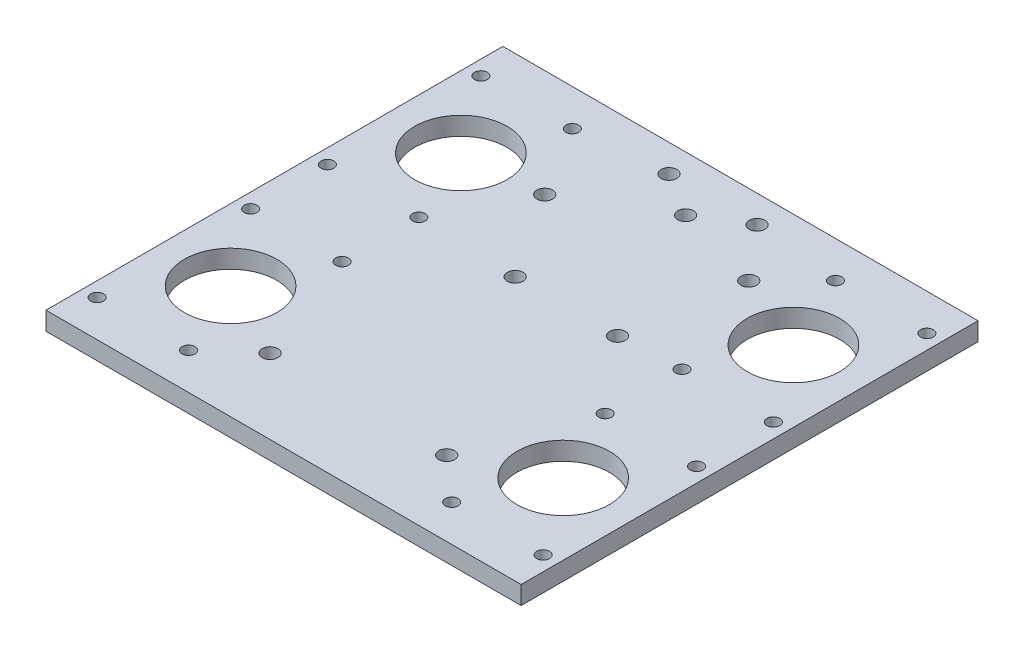
ISO-10303-21;
HEADER;
FILE_DESCRIPTION(('STEP AP214'),'2;1');
FILE_NAME('part.step','',(''),(''),'','','');
FILE_SCHEMA(('AUTOMOTIVE_DESIGN { 1 0 10303 214 1 1 1 1 }'));
ENDSEC;
DATA;
#1=APPLICATION_CONTEXT('core data for automotive mechanical design processes');
#2=APPLICATION_PROTOCOL_DEFINITION('international standard','automotive_design',2000,#1);
#3=PRODUCT_CONTEXT('',#1,'mechanical');
#4=PRODUCT('Part','Part','',(#3));
#5=PRODUCT_RELATED_PRODUCT_CATEGORY('part','',(#4));
#6=PRODUCT_DEFINITION_FORMATION('','',#4);
#7=PRODUCT_DEFINITION_CONTEXT('part definition',#1,'design');
#8=PRODUCT_DEFINITION('design','',#6,#7);
#9=PRODUCT_DEFINITION_SHAPE('','',#8);
#10=(LENGTH_UNIT() NAMED_UNIT(*) SI_UNIT(.MILLI.,.METRE.));
#11=(NAMED_UNIT(*) PLANE_ANGLE_UNIT() SI_UNIT($,.RADIAN.));
#12=(NAMED_UNIT(*) SI_UNIT($,.STERADIAN.) SOLID_ANGLE_UNIT());
#13=UNCERTAINTY_MEASURE_WITH_UNIT(LENGTH_MEASURE(1.E-05),#10,'distance_accuracy_value','');
#14=(GEOMETRIC_REPRESENTATION_CONTEXT(3) GLOBAL_UNCERTAINTY_ASSIGNED_CONTEXT((#13)) GLOBAL_UNIT_ASSIGNED_CONTEXT((#10,
#11,#12)) REPRESENTATION_CONTEXT('',''));
#15=CARTESIAN_POINT('',(0.,0.,0.));
#16=DIRECTION('',(0.,0.,1.));
#17=DIRECTION('',(1.,0.,0.));
#18=AXIS2_PLACEMENT_3D('',#15,#16,#17);
#19=CARTESIAN_POINT('',(65.,5.,-62.5));
#20=DIRECTION('',(-1.,0.,0.));
#21=DIRECTION('',(0.,0.,1.));
#22=AXIS2_PLACEMENT_3D('',#19,#20,#21);
#23=PLANE('',#22);
#24=DIRECTION('',(0.,0.,-1.));
#25=VECTOR('',#24,1.);
#26=CARTESIAN_POINT('',(65.,0.,-62.5));
#27=LINE('',#26,#25);
#28=CARTESIAN_POINT('',(65.,0.,62.5));
#29=VERTEX_POINT('',#28);
#30=CARTESIAN_POINT('',(65.,0.,-62.5));
#31=VERTEX_POINT('',#30);
#32=EDGE_CURVE('E110',#29,#31,#27,.T.);
#33=ORIENTED_EDGE('',*,*,#32,.T.);
#34=DIRECTION('',(0.,-1.,0.));
#35=VECTOR('',#34,1.);
#36=CARTESIAN_POINT('',(65.,5.,-62.5));
#37=LINE('',#36,#35);
#38=CARTESIAN_POINT('',(65.,5.,-62.5));
#39=VERTEX_POINT('',#38);
#40=EDGE_CURVE('E11',#39,#31,#37,.T.);
#41=ORIENTED_EDGE('',*,*,#40,.F.);
#42=DIRECTION('',(0.,0.,-1.));
#43=VECTOR('',#42,1.);
#44=CARTESIAN_POINT('',(65.,5.,-62.5));
#45=LINE('',#44,#43);
#46=CARTESIAN_POINT('',(65.,5.,62.5));
#47=VERTEX_POINT('',#46);
#48=EDGE_CURVE('E93',#47,#39,#45,.T.);
#49=ORIENTED_EDGE('',*,*,#48,.F.);
#50=DIRECTION('',(0.,-1.,0.));
#51=VECTOR('',#50,1.);
#52=CARTESIAN_POINT('',(65.,5.,62.5));
#53=LINE('',#52,#51);
#54=EDGE_CURVE('E106',#47,#29,#53,.T.);
#55=ORIENTED_EDGE('',*,*,#54,.T.);
#56=EDGE_LOOP('',(#33,#41,#49,#55));
#57=FACE_BOUND('',#56,.T.);
#58=ADVANCED_FACE('F39',(#57),#23,.F.);
#59=CARTESIAN_POINT('',(-65.,5.,-62.5));
#60=DIRECTION('',(0.,0.,1.));
#61=DIRECTION('',(1.,0.,0.));
#62=AXIS2_PLACEMENT_3D('',#59,#60,#61);
#63=PLANE('',#62);
#64=DIRECTION('',(-1.,0.,0.));
#65=VECTOR('',#64,1.);
#66=CARTESIAN_POINT('',(-65.,0.,-62.5));
#67=LINE('',#66,#65);
#68=CARTESIAN_POINT('',(-65.,0.,-62.5));
#69=VERTEX_POINT('',#68);
#70=EDGE_CURVE('E98',#31,#69,#67,.T.);
#71=ORIENTED_EDGE('',*,*,#70,.T.);
#72=DIRECTION('',(0.,-1.,0.));
#73=VECTOR('',#72,1.);
#74=CARTESIAN_POINT('',(-65.,5.,-62.5));
#75=LINE('',#74,#73);
#76=CARTESIAN_POINT('',(-65.,5.,-62.5));
#77=VERTEX_POINT('',#76);
#78=EDGE_CURVE('E49',#77,#69,#75,.T.);
#79=ORIENTED_EDGE('',*,*,#78,.F.);
#80=DIRECTION('',(-1.,0.,0.));
#81=VECTOR('',#80,1.);
#82=CARTESIAN_POINT('',(-65.,5.,-62.5));
#83=LINE('',#82,#81);
#84=EDGE_CURVE('E88',#39,#77,#83,.T.);
#85=ORIENTED_EDGE('',*,*,#84,.F.);
#86=ORIENTED_EDGE('',*,*,#40,.T.);
#87=EDGE_LOOP('',(#71,#79,#85,#86));
#88=FACE_BOUND('',#87,.T.);
#89=ADVANCED_FACE('F97',(#88),#63,.F.);
#90=CARTESIAN_POINT('',(-65.,5.,-62.5));
#91=DIRECTION('',(1.,0.,0.));
#92=DIRECTION('',(0.,0.,-1.));
#93=AXIS2_PLACEMENT_3D('',#90,#91,#92);
#94=PLANE('',#93);
#95=DIRECTION('',(0.,0.,1.));
#96=VECTOR('',#95,1.);
#97=CARTESIAN_POINT('',(-65.,0.,-62.5));
#98=LINE('',#97,#96);
#99=CARTESIAN_POINT('',(-65.,0.,62.5));
#100=VERTEX_POINT('',#99);
#101=EDGE_CURVE('E75',#69,#100,#98,.T.);
#102=ORIENTED_EDGE('',*,*,#101,.T.);
#103=DIRECTION('',(0.,-1.,0.));
#104=VECTOR('',#103,1.);
#105=CARTESIAN_POINT('',(-65.,5.,62.5));
#106=LINE('',#105,#104);
#107=CARTESIAN_POINT('',(-65.,5.,62.5));
#108=VERTEX_POINT('',#107);
#109=EDGE_CURVE('E100',#108,#100,#106,.T.);
#110=ORIENTED_EDGE('',*,*,#109,.F.);
#111=DIRECTION('',(0.,0.,1.));
#112=VECTOR('',#111,1.);
#113=CARTESIAN_POINT('',(-65.,5.,-62.5));
#114=LINE('',#113,#112);
#115=EDGE_CURVE('E91',#77,#108,#114,.T.);
#116=ORIENTED_EDGE('',*,*,#115,.F.);
#117=ORIENTED_EDGE('',*,*,#78,.T.);
#118=EDGE_LOOP('',(#102,#110,#116,#117));
#119=FACE_BOUND('',#118,.T.);
#120=ADVANCED_FACE('F102',(#119),#94,.F.);
#121=CARTESIAN_POINT('',(-65.,5.,62.5));
#122=DIRECTION('',(0.,0.,-1.));
#123=DIRECTION('',(-1.,0.,0.));
#124=AXIS2_PLACEMENT_3D('',#121,#122,#123);
#125=PLANE('',#124);
#126=DIRECTION('',(1.,0.,0.));
#127=VECTOR('',#126,1.);
#128=CARTESIAN_POINT('',(-65.,0.,62.5));
#129=LINE('',#128,#127);
#130=EDGE_CURVE('E81',#100,#29,#129,.T.);
#131=ORIENTED_EDGE('',*,*,#130,.T.);
#132=ORIENTED_EDGE('',*,*,#54,.F.);
#133=DIRECTION('',(1.,0.,0.));
#134=VECTOR('',#133,1.);
#135=CARTESIAN_POINT('',(-65.,5.,62.5));
#136=LINE('',#135,#134);
#137=EDGE_CURVE('E58',#108,#47,#136,.T.);
#138=ORIENTED_EDGE('',*,*,#137,.F.);
#139=ORIENTED_EDGE('',*,*,#109,.T.);
#140=EDGE_LOOP('',(#131,#132,#138,#139));
#141=FACE_BOUND('',#140,.T.);
#142=ADVANCED_FACE('F369',(#141),#125,.F.);
#143=CARTESIAN_POINT('',(0.,5.,0.));
#144=DIRECTION('',(0.,1.,0.));
#145=DIRECTION('',(0.,0.,1.));
#146=AXIS2_PLACEMENT_3D('',#143,#144,#145);
#147=PLANE('',#146);
#148=CARTESIAN_POINT('',(0.,5.,-47.5));
#149=DIRECTION('',(0.,1.,0.));
#150=DIRECTION('',(0.,0.,1.));
#151=AXIS2_PLACEMENT_3D('',#148,#149,#150);
#152=CIRCLE('',#151,2.15);
#153=CARTESIAN_POINT('',(0.,5.,-45.35));
#154=VERTEX_POINT('',#153);
#155=EDGE_CURVE('E241',#154,#154,#152,.T.);
#156=ORIENTED_EDGE('',*,*,#155,.F.);
#157=EDGE_LOOP('',(#156));
#158=FACE_BOUND('',#157,.T.);
#159=CARTESIAN_POINT('',(12.0498102049993,5.,-55.));
#160=DIRECTION('',(0.,1.,0.));
#161=DIRECTION('',(0.,0.,1.));
#162=AXIS2_PLACEMENT_3D('',#159,#160,#161);
#163=CIRCLE('',#162,2.15);
#164=CARTESIAN_POINT('',(12.0498102049993,5.,-52.85));
#165=VERTEX_POINT('',#164);
#166=EDGE_CURVE('E355',#165,#165,#163,.T.);
#167=ORIENTED_EDGE('',*,*,#166,.F.);
#168=EDGE_LOOP('',(#167));
#169=FACE_BOUND('',#168,.T.);
#170=CARTESIAN_POINT('',(-12.0498102049993,5.,-55.));
#171=DIRECTION('',(0.,1.,0.));
#172=DIRECTION('',(0.,0.,1.));
#173=AXIS2_PLACEMENT_3D('',#170,#171,#172);
#174=CIRCLE('',#173,2.15);
#175=CARTESIAN_POINT('',(-12.0498102049993,5.,-52.85));
#176=VERTEX_POINT('',#175);
#177=EDGE_CURVE('E351',#176,#176,#174,.T.);
#178=ORIENTED_EDGE('',*,*,#177,.F.);
#179=EDGE_LOOP('',(#178));
#180=FACE_BOUND('',#179,.T.);
#181=CARTESIAN_POINT('',(24.17,5.,-40.6));
#182=DIRECTION('',(0.,1.,0.));
#183=DIRECTION('',(0.,0.,1.));
#184=AXIS2_PLACEMENT_3D('',#181,#182,#183);
#185=CIRCLE('',#184,2.15);
#186=CARTESIAN_POINT('',(24.17,5.,-38.45));
#187=VERTEX_POINT('',#186);
#188=EDGE_CURVE('E248',#187,#187,#185,.T.);
#189=ORIENTED_EDGE('',*,*,#188,.F.);
#190=EDGE_LOOP('',(#189));
#191=FACE_BOUND('',#190,.T.);
#192=CARTESIAN_POINT('',(24.17,5.,42.03));
#193=DIRECTION('',(0.,1.,0.));
#194=DIRECTION('',(0.,0.,1.));
#195=AXIS2_PLACEMENT_3D('',#192,#193,#194);
#196=CIRCLE('',#195,2.15);
#197=CARTESIAN_POINT('',(24.17,5.,44.18));
#198=VERTEX_POINT('',#197);
#199=EDGE_CURVE('E268',#198,#198,#196,.T.);
#200=ORIENTED_EDGE('',*,*,#199,.F.);
#201=EDGE_LOOP('',(#200));
#202=FACE_BOUND('',#201,.T.);
#203=CARTESIAN_POINT('',(-8.73,5.,-9.6));
#204=DIRECTION('',(0.,1.,0.));
#205=DIRECTION('',(0.,0.,1.));
#206=AXIS2_PLACEMENT_3D('',#203,#204,#205);
#207=CIRCLE('',#206,2.15);
#208=CARTESIAN_POINT('',(-8.73,5.,-7.45));
#209=VERTEX_POINT('',#208);
#210=EDGE_CURVE('E263',#209,#209,#207,.T.);
#211=ORIENTED_EDGE('',*,*,#210,.F.);
#212=EDGE_LOOP('',(#211));
#213=FACE_BOUND('',#212,.T.);
#214=CARTESIAN_POINT('',(19.29,5.,-9.6));
#215=DIRECTION('',(0.,1.,0.));
#216=DIRECTION('',(0.,0.,1.));
#217=AXIS2_PLACEMENT_3D('',#214,#215,#216);
#218=CIRCLE('',#217,2.15);
#219=CARTESIAN_POINT('',(19.29,5.,-7.45));
#220=VERTEX_POINT('',#219);
#221=EDGE_CURVE('E259',#220,#220,#218,.T.);
#222=ORIENTED_EDGE('',*,*,#221,.F.);
#223=EDGE_LOOP('',(#222));
#224=FACE_BOUND('',#223,.T.);
#225=CARTESIAN_POINT('',(-24.17,5.,-33.11));
#226=DIRECTION('',(0.,1.,0.));
#227=DIRECTION('',(0.,0.,1.));
#228=AXIS2_PLACEMENT_3D('',#225,#226,#227);
#229=CIRCLE('',#228,2.15);
#230=CARTESIAN_POINT('',(-24.17,5.,-30.96));
#231=VERTEX_POINT('',#230);
#232=EDGE_CURVE('E253',#231,#231,#229,.T.);
#233=ORIENTED_EDGE('',*,*,#232,.F.);
#234=EDGE_LOOP('',(#233));
#235=FACE_BOUND('',#234,.T.);
#236=CARTESIAN_POINT('',(-24.17,5.,42.03));
#237=DIRECTION('',(0.,1.,0.));
#238=DIRECTION('',(0.,0.,1.));
#239=AXIS2_PLACEMENT_3D('',#236,#237,#238);
#240=CIRCLE('',#239,2.15);
#241=CARTESIAN_POINT('',(-24.17,5.,44.18));
#242=VERTEX_POINT('',#241);
#243=EDGE_CURVE('E216',#242,#242,#240,.T.);
#244=ORIENTED_EDGE('',*,*,#243,.F.);
#245=EDGE_LOOP('',(#244));
#246=FACE_BOUND('',#245,.T.);
#247=CARTESIAN_POINT('',(-36.,5.,-52.5));
#248=DIRECTION('',(0.,-1.,0.));
#249=DIRECTION('',(0.,0.,-1.));
#250=AXIS2_PLACEMENT_3D('',#247,#248,#249);
#251=CIRCLE('',#250,1.75);
#252=CARTESIAN_POINT('',(-36.,5.,-54.25));
#253=VERTEX_POINT('',#252);
#254=EDGE_CURVE('E277',#253,#253,#251,.T.);
#255=ORIENTED_EDGE('',*,*,#254,.T.);
#256=EDGE_LOOP('',(#255));
#257=FACE_BOUND('',#256,.T.);
#258=CARTESIAN_POINT('',(-36.,5.,-10.5));
#259=DIRECTION('',(0.,-1.,0.));
#260=DIRECTION('',(0.,0.,-1.));
#261=AXIS2_PLACEMENT_3D('',#258,#259,#260);
#262=CIRCLE('',#261,1.75);
#263=CARTESIAN_POINT('',(-36.,5.,-12.25));
#264=VERTEX_POINT('',#263);
#265=EDGE_CURVE('E273',#264,#264,#262,.T.);
#266=ORIENTED_EDGE('',*,*,#265,.T.);
#267=EDGE_LOOP('',(#266));
#268=FACE_BOUND('',#267,.T.);
#269=CARTESIAN_POINT('',(-61.,5.,-10.5));
#270=DIRECTION('',(0.,-1.,0.));
#271=DIRECTION('',(0.,0.,-1.));
#272=AXIS2_PLACEMENT_3D('',#269,#270,#271);
#273=CIRCLE('',#272,1.75);
#274=CARTESIAN_POINT('',(-61.,5.,-12.25));
#275=VERTEX_POINT('',#274);
#276=EDGE_CURVE('E269',#275,#275,#273,.T.);
#277=ORIENTED_EDGE('',*,*,#276,.T.);
#278=EDGE_LOOP('',(#277));
#279=FACE_BOUND('',#278,.T.);
#280=CARTESIAN_POINT('',(-45.5,5.,-31.5));
#281=DIRECTION('',(0.,-1.,0.));
#282=DIRECTION('',(0.,0.,-1.));
#283=AXIS2_PLACEMENT_3D('',#280,#281,#282);
#284=CIRCLE('',#283,12.65);
#285=CARTESIAN_POINT('',(-45.5,5.,-44.15));
#286=VERTEX_POINT('',#285);
#287=EDGE_CURVE('E236',#286,#286,#284,.T.);
#288=ORIENTED_EDGE('',*,*,#287,.T.);
#289=EDGE_LOOP('',(#288));
#290=FACE_BOUND('',#289,.T.);
#291=CARTESIAN_POINT('',(-61.,5.,-52.5));
#292=DIRECTION('',(0.,-1.,0.));
#293=DIRECTION('',(0.,0.,-1.));
#294=AXIS2_PLACEMENT_3D('',#291,#292,#293);
#295=CIRCLE('',#294,1.75);
#296=CARTESIAN_POINT('',(-61.,5.,-54.25));
#297=VERTEX_POINT('',#296);
#298=EDGE_CURVE('E194',#297,#297,#295,.T.);
#299=ORIENTED_EDGE('',*,*,#298,.T.);
#300=EDGE_LOOP('',(#299));
#301=FACE_BOUND('',#300,.T.);
#302=CARTESIAN_POINT('',(36.,5.,-52.5));
#303=DIRECTION('',(0.,1.,0.));
#304=DIRECTION('',(0.,0.,-1.));
#305=AXIS2_PLACEMENT_3D('',#302,#303,#304);
#306=CIRCLE('',#305,1.75);
#307=CARTESIAN_POINT('',(36.,5.,-54.25));
#308=VERTEX_POINT('',#307);
#309=EDGE_CURVE('E295',#308,#308,#306,.T.);
#310=ORIENTED_EDGE('',*,*,#309,.F.);
#311=EDGE_LOOP('',(#310));
#312=FACE_BOUND('',#311,.T.);
#313=CARTESIAN_POINT('',(36.,5.,-10.5));
#314=DIRECTION('',(0.,1.,0.));
#315=DIRECTION('',(0.,0.,-1.));
#316=AXIS2_PLACEMENT_3D('',#313,#314,#315);
#317=CIRCLE('',#316,1.75);
#318=CARTESIAN_POINT('',(36.,5.,-12.25));
#319=VERTEX_POINT('',#318);
#320=EDGE_CURVE('E291',#319,#319,#317,.T.);
#321=ORIENTED_EDGE('',*,*,#320,.F.);
#322=EDGE_LOOP('',(#321));
#323=FACE_BOUND('',#322,.T.);
#324=CARTESIAN_POINT('',(61.,5.,-10.5));
#325=DIRECTION('',(0.,1.,0.));
#326=DIRECTION('',(0.,0.,-1.));
#327=AXIS2_PLACEMENT_3D('',#324,#325,#326);
#328=CIRCLE('',#327,1.75);
#329=CARTESIAN_POINT('',(61.,5.,-12.25));
#330=VERTEX_POINT('',#329);
#331=EDGE_CURVE('E287',#330,#330,#328,.T.);
#332=ORIENTED_EDGE('',*,*,#331,.F.);
#333=EDGE_LOOP('',(#332));
#334=FACE_BOUND('',#333,.T.);
#335=CARTESIAN_POINT('',(45.5,5.,-31.5));
#336=DIRECTION('',(0.,1.,0.));
#337=DIRECTION('',(0.,0.,-1.));
#338=AXIS2_PLACEMENT_3D('',#335,#336,#337);
#339=CIRCLE('',#338,12.65);
#340=CARTESIAN_POINT('',(45.5,5.,-44.15));
#341=VERTEX_POINT('',#340);
#342=EDGE_CURVE('E210',#341,#341,#339,.T.);
#343=ORIENTED_EDGE('',*,*,#342,.F.);
#344=EDGE_LOOP('',(#343));
#345=FACE_BOUND('',#344,.T.);
#346=CARTESIAN_POINT('',(61.,5.,-52.5));
#347=DIRECTION('',(0.,1.,0.));
#348=DIRECTION('',(0.,0.,-1.));
#349=AXIS2_PLACEMENT_3D('',#346,#347,#348);
#350=CIRCLE('',#349,1.75);
#351=CARTESIAN_POINT('',(61.,5.,-54.25));
#352=VERTEX_POINT('',#351);
#353=EDGE_CURVE('E172',#352,#352,#350,.T.);
#354=ORIENTED_EDGE('',*,*,#353,.F.);
#355=EDGE_LOOP('',(#354));
#356=FACE_BOUND('',#355,.T.);
#357=CARTESIAN_POINT('',(36.,5.,52.5));
#358=DIRECTION('',(0.,-1.,0.));
#359=DIRECTION('',(0.,0.,1.));
#360=AXIS2_PLACEMENT_3D('',#357,#358,#359);
#361=CIRCLE('',#360,1.75);
#362=CARTESIAN_POINT('',(36.,5.,54.25));
#363=VERTEX_POINT('',#362);
#364=EDGE_CURVE('E313',#363,#363,#361,.T.);
#365=ORIENTED_EDGE('',*,*,#364,.T.);
#366=EDGE_LOOP('',(#365));
#367=FACE_BOUND('',#366,.T.);
#368=CARTESIAN_POINT('',(36.,5.,10.5));
#369=DIRECTION('',(0.,-1.,0.));
#370=DIRECTION('',(0.,0.,1.));
#371=AXIS2_PLACEMENT_3D('',#368,#369,#370);
#372=CIRCLE('',#371,1.75);
#373=CARTESIAN_POINT('',(36.,5.,12.25));
#374=VERTEX_POINT('',#373);
#375=EDGE_CURVE('E309',#374,#374,#372,.T.);
#376=ORIENTED_EDGE('',*,*,#375,.T.);
#377=EDGE_LOOP('',(#376));
#378=FACE_BOUND('',#377,.T.);
#379=CARTESIAN_POINT('',(61.,5.,10.5));
#380=DIRECTION('',(0.,-1.,0.));
#381=DIRECTION('',(0.,0.,1.));
#382=AXIS2_PLACEMENT_3D('',#379,#380,#381);
#383=CIRCLE('',#382,1.75);
#384=CARTESIAN_POINT('',(61.,5.,12.25));
#385=VERTEX_POINT('',#384);
#386=EDGE_CURVE('E305',#385,#385,#383,.T.);
#387=ORIENTED_EDGE('',*,*,#386,.T.);
#388=EDGE_LOOP('',(#387));
#389=FACE_BOUND('',#388,.T.);
#390=CARTESIAN_POINT('',(45.5,5.,31.5));
#391=DIRECTION('',(0.,-1.,0.));
#392=DIRECTION('',(0.,0.,1.));
#393=AXIS2_PLACEMENT_3D('',#390,#391,#392);
#394=CIRCLE('',#393,12.65);
#395=CARTESIAN_POINT('',(45.5,5.,44.15));
#396=VERTEX_POINT('',#395);
#397=EDGE_CURVE('E188',#396,#396,#394,.T.);
#398=ORIENTED_EDGE('',*,*,#397,.T.);
#399=EDGE_LOOP('',(#398));
#400=FACE_BOUND('',#399,.T.);
#401=CARTESIAN_POINT('',(61.,5.,52.5));
#402=DIRECTION('',(0.,-1.,0.));
#403=DIRECTION('',(0.,0.,1.));
#404=AXIS2_PLACEMENT_3D('',#401,#402,#403);
#405=CIRCLE('',#404,1.75);
#406=CARTESIAN_POINT('',(61.,5.,54.25));
#407=VERTEX_POINT('',#406);
#408=EDGE_CURVE('E150',#407,#407,#405,.T.);
#409=ORIENTED_EDGE('',*,*,#408,.T.);
#410=EDGE_LOOP('',(#409));
#411=FACE_BOUND('',#410,.T.);
#412=CARTESIAN_POINT('',(-36.,5.,52.5));
#413=DIRECTION('',(0.,1.,0.));
#414=DIRECTION('',(0.,0.,1.));
#415=AXIS2_PLACEMENT_3D('',#412,#413,#414);
#416=CIRCLE('',#415,1.75);
#417=CARTESIAN_POINT('',(-36.,5.,54.25));
#418=VERTEX_POINT('',#417);
#419=EDGE_CURVE('E331',#418,#418,#416,.T.);
#420=ORIENTED_EDGE('',*,*,#419,.F.);
#421=EDGE_LOOP('',(#420));
#422=FACE_BOUND('',#421,.T.);
#423=CARTESIAN_POINT('',(-36.,5.,10.5));
#424=DIRECTION('',(0.,1.,0.));
#425=DIRECTION('',(0.,0.,1.));
#426=AXIS2_PLACEMENT_3D('',#423,#424,#425);
#427=CIRCLE('',#426,1.75);
#428=CARTESIAN_POINT('',(-36.,5.,12.25));
#429=VERTEX_POINT('',#428);
#430=EDGE_CURVE('E327',#429,#429,#427,.T.);
#431=ORIENTED_EDGE('',*,*,#430,.F.);
#432=EDGE_LOOP('',(#431));
#433=FACE_BOUND('',#432,.T.);
#434=CARTESIAN_POINT('',(-61.,5.,10.5));
#435=DIRECTION('',(0.,1.,0.));
#436=DIRECTION('',(0.,0.,1.));
#437=AXIS2_PLACEMENT_3D('',#434,#435,#436);
#438=CIRCLE('',#437,1.75);
#439=CARTESIAN_POINT('',(-61.,5.,12.25));
#440=VERTEX_POINT('',#439);
#441=EDGE_CURVE('E323',#440,#440,#438,.T.);
#442=ORIENTED_EDGE('',*,*,#441,.F.);
#443=EDGE_LOOP('',(#442));
#444=FACE_BOUND('',#443,.T.);
#445=CARTESIAN_POINT('',(-45.5,5.,31.5));
#446=DIRECTION('',(0.,1.,0.));
#447=DIRECTION('',(0.,0.,1.));
#448=AXIS2_PLACEMENT_3D('',#445,#446,#447);
#449=CIRCLE('',#448,12.65);
#450=CARTESIAN_POINT('',(-45.5,5.,44.15));
#451=VERTEX_POINT('',#450);
#452=EDGE_CURVE('E166',#451,#451,#449,.T.);
#453=ORIENTED_EDGE('',*,*,#452,.F.);
#454=EDGE_LOOP('',(#453));
#455=FACE_BOUND('',#454,.T.);
#456=CARTESIAN_POINT('',(-61.,5.,52.5));
#457=DIRECTION('',(0.,1.,0.));
#458=DIRECTION('',(0.,0.,1.));
#459=AXIS2_PLACEMENT_3D('',#456,#457,#458);
#460=CIRCLE('',#459,1.75);
#461=CARTESIAN_POINT('',(-61.,5.,54.25));
#462=VERTEX_POINT('',#461);
#463=EDGE_CURVE('E130',#462,#462,#460,.T.);
#464=ORIENTED_EDGE('',*,*,#463,.F.);
#465=EDGE_LOOP('',(#464));
#466=FACE_BOUND('',#465,.T.);
#467=ORIENTED_EDGE('',*,*,#48,.T.);
#468=ORIENTED_EDGE('',*,*,#84,.T.);
#469=ORIENTED_EDGE('',*,*,#115,.T.);
#470=ORIENTED_EDGE('',*,*,#137,.T.);
#471=EDGE_LOOP('',(#467,#468,#469,#470));
#472=FACE_BOUND('',#471,.T.);
#473=ADVANCED_FACE('F89',(#158,#169,#180,#191,#202,#213,#224,#235,#246,#257,#268,#279,#290,#301,
#312,#323,#334,#345,#356,#367,#378,#389,#400,#411,#422,#433,#444,#455,#466,#472),#147,.T.);
#474=CARTESIAN_POINT('',(0.,0.,0.));
#475=DIRECTION('',(0.,1.,0.));
#476=DIRECTION('',(0.,0.,1.));
#477=AXIS2_PLACEMENT_3D('',#474,#475,#476);
#478=PLANE('',#477);
#479=CARTESIAN_POINT('',(0.,0.,-47.5));
#480=DIRECTION('',(0.,1.,0.));
#481=DIRECTION('',(0.,0.,1.));
#482=AXIS2_PLACEMENT_3D('',#479,#480,#481);
#483=CIRCLE('',#482,2.15);
#484=CARTESIAN_POINT('',(0.,0.,-45.35));
#485=VERTEX_POINT('',#484);
#486=EDGE_CURVE('E42',#485,#485,#483,.T.);
#487=ORIENTED_EDGE('',*,*,#486,.T.);
#488=EDGE_LOOP('',(#487));
#489=FACE_BOUND('',#488,.T.);
#490=CARTESIAN_POINT('',(12.0498102049993,0.,-55.));
#491=DIRECTION('',(0.,1.,0.));
#492=DIRECTION('',(0.,0.,1.));
#493=AXIS2_PLACEMENT_3D('',#490,#491,#492);
#494=CIRCLE('',#493,2.15);
#495=CARTESIAN_POINT('',(12.0498102049993,0.,-52.85));
#496=VERTEX_POINT('',#495);
#497=EDGE_CURVE('E240',#496,#496,#494,.T.);
#498=ORIENTED_EDGE('',*,*,#497,.T.);
#499=EDGE_LOOP('',(#498));
#500=FACE_BOUND('',#499,.T.);
#501=CARTESIAN_POINT('',(-12.0498102049993,0.,-55.));
#502=DIRECTION('',(0.,1.,0.));
#503=DIRECTION('',(0.,0.,1.));
#504=AXIS2_PLACEMENT_3D('',#501,#502,#503);
#505=CIRCLE('',#504,2.15);
#506=CARTESIAN_POINT('',(-12.0498102049993,0.,-52.85));
#507=VERTEX_POINT('',#506);
#508=EDGE_CURVE('E237',#507,#507,#505,.T.);
#509=ORIENTED_EDGE('',*,*,#508,.T.);
#510=EDGE_LOOP('',(#509));
#511=FACE_BOUND('',#510,.T.);
#512=CARTESIAN_POINT('',(24.17,0.,-40.6));
#513=DIRECTION('',(0.,1.,0.));
#514=DIRECTION('',(0.,0.,1.));
#515=AXIS2_PLACEMENT_3D('',#512,#513,#514);
#516=CIRCLE('',#515,2.15);
#517=CARTESIAN_POINT('',(24.17,0.,-38.45));
#518=VERTEX_POINT('',#517);
#519=EDGE_CURVE('E232',#518,#518,#516,.T.);
#520=ORIENTED_EDGE('',*,*,#519,.T.);
#521=EDGE_LOOP('',(#520));
#522=FACE_BOUND('',#521,.T.);
#523=CARTESIAN_POINT('',(24.17,0.,42.03));
#524=DIRECTION('',(0.,1.,0.));
#525=DIRECTION('',(0.,0.,1.));
#526=AXIS2_PLACEMENT_3D('',#523,#524,#525);
#527=CIRCLE('',#526,2.15);
#528=CARTESIAN_POINT('',(24.17,0.,44.18));
#529=VERTEX_POINT('',#528);
#530=EDGE_CURVE('E228',#529,#529,#527,.T.);
#531=ORIENTED_EDGE('',*,*,#530,.T.);
#532=EDGE_LOOP('',(#531));
#533=FACE_BOUND('',#532,.T.);
#534=CARTESIAN_POINT('',(-8.73,0.,-9.6));
#535=DIRECTION('',(0.,1.,0.));
#536=DIRECTION('',(0.,0.,1.));
#537=AXIS2_PLACEMENT_3D('',#534,#535,#536);
#538=CIRCLE('',#537,2.15);
#539=CARTESIAN_POINT('',(-8.73,0.,-7.45));
#540=VERTEX_POINT('',#539);
#541=EDGE_CURVE('E224',#540,#540,#538,.T.);
#542=ORIENTED_EDGE('',*,*,#541,.T.);
#543=EDGE_LOOP('',(#542));
#544=FACE_BOUND('',#543,.T.);
#545=CARTESIAN_POINT('',(19.29,0.,-9.6));
#546=DIRECTION('',(0.,1.,0.));
#547=DIRECTION('',(0.,0.,1.));
#548=AXIS2_PLACEMENT_3D('',#545,#546,#547);
#549=CIRCLE('',#548,2.15);
#550=CARTESIAN_POINT('',(19.29,0.,-7.45));
#551=VERTEX_POINT('',#550);
#552=EDGE_CURVE('E220',#551,#551,#549,.T.);
#553=ORIENTED_EDGE('',*,*,#552,.T.);
#554=EDGE_LOOP('',(#553));
#555=FACE_BOUND('',#554,.T.);
#556=CARTESIAN_POINT('',(-24.17,0.,-33.11));
#557=DIRECTION('',(0.,1.,0.));
#558=DIRECTION('',(0.,0.,1.));
#559=AXIS2_PLACEMENT_3D('',#556,#557,#558);
#560=CIRCLE('',#559,2.15);
#561=CARTESIAN_POINT('',(-24.17,0.,-30.96));
#562=VERTEX_POINT('',#561);
#563=EDGE_CURVE('E215',#562,#562,#560,.T.);
#564=ORIENTED_EDGE('',*,*,#563,.T.);
#565=EDGE_LOOP('',(#564));
#566=FACE_BOUND('',#565,.T.);
#567=CARTESIAN_POINT('',(-24.17,0.,42.03));
#568=DIRECTION('',(0.,1.,0.));
#569=DIRECTION('',(0.,0.,1.));
#570=AXIS2_PLACEMENT_3D('',#567,#568,#569);
#571=CIRCLE('',#570,2.15);
#572=CARTESIAN_POINT('',(-24.17,0.,44.18));
#573=VERTEX_POINT('',#572);
#574=EDGE_CURVE('E211',#573,#573,#571,.T.);
#575=ORIENTED_EDGE('',*,*,#574,.T.);
#576=EDGE_LOOP('',(#575));
#577=FACE_BOUND('',#576,.T.);
#578=CARTESIAN_POINT('',(-36.,0.,-52.5));
#579=DIRECTION('',(0.,1.,0.));
#580=DIRECTION('',(0.,0.,1.));
#581=AXIS2_PLACEMENT_3D('',#578,#579,#580);
#582=CIRCLE('',#581,1.75);
#583=CARTESIAN_POINT('',(-36.,0.,-50.75));
#584=VERTEX_POINT('',#583);
#585=EDGE_CURVE('E206',#584,#584,#582,.F.);
#586=ORIENTED_EDGE('',*,*,#585,.F.);
#587=EDGE_LOOP('',(#586));
#588=FACE_BOUND('',#587,.T.);
#589=CARTESIAN_POINT('',(-36.,0.,-10.5));
#590=DIRECTION('',(0.,1.,0.));
#591=DIRECTION('',(0.,0.,1.));
#592=AXIS2_PLACEMENT_3D('',#589,#590,#591);
#593=CIRCLE('',#592,1.75);
#594=CARTESIAN_POINT('',(-36.,0.,-8.74999999999999));
#595=VERTEX_POINT('',#594);
#596=EDGE_CURVE('E202',#595,#595,#593,.F.);
#597=ORIENTED_EDGE('',*,*,#596,.F.);
#598=EDGE_LOOP('',(#597));
#599=FACE_BOUND('',#598,.T.);
#600=CARTESIAN_POINT('',(-61.,0.,-10.5));
#601=DIRECTION('',(0.,1.,0.));
#602=DIRECTION('',(0.,0.,1.));
#603=AXIS2_PLACEMENT_3D('',#600,#601,#602);
#604=CIRCLE('',#603,1.75);
#605=CARTESIAN_POINT('',(-61.,0.,-8.75));
#606=VERTEX_POINT('',#605);
#607=EDGE_CURVE('E198',#606,#606,#604,.F.);
#608=ORIENTED_EDGE('',*,*,#607,.F.);
#609=EDGE_LOOP('',(#608));
#610=FACE_BOUND('',#609,.T.);
#611=CARTESIAN_POINT('',(-45.5,0.,-31.5));
#612=DIRECTION('',(0.,1.,0.));
#613=DIRECTION('',(0.,0.,1.));
#614=AXIS2_PLACEMENT_3D('',#611,#612,#613);
#615=CIRCLE('',#614,12.65);
#616=CARTESIAN_POINT('',(-45.5,0.,-18.85));
#617=VERTEX_POINT('',#616);
#618=EDGE_CURVE('E193',#617,#617,#615,.F.);
#619=ORIENTED_EDGE('',*,*,#618,.F.);
#620=EDGE_LOOP('',(#619));
#621=FACE_BOUND('',#620,.T.);
#622=CARTESIAN_POINT('',(-61.,0.,-52.5));
#623=DIRECTION('',(0.,1.,0.));
#624=DIRECTION('',(0.,0.,1.));
#625=AXIS2_PLACEMENT_3D('',#622,#623,#624);
#626=CIRCLE('',#625,1.75);
#627=CARTESIAN_POINT('',(-61.,0.,-50.75));
#628=VERTEX_POINT('',#627);
#629=EDGE_CURVE('E189',#628,#628,#626,.F.);
#630=ORIENTED_EDGE('',*,*,#629,.F.);
#631=EDGE_LOOP('',(#630));
#632=FACE_BOUND('',#631,.T.);
#633=CARTESIAN_POINT('',(36.,0.,-52.5));
#634=DIRECTION('',(0.,1.,0.));
#635=DIRECTION('',(0.,0.,1.));
#636=AXIS2_PLACEMENT_3D('',#633,#634,#635);
#637=CIRCLE('',#636,1.75);
#638=CARTESIAN_POINT('',(36.,0.,-50.75));
#639=VERTEX_POINT('',#638);
#640=EDGE_CURVE('E184',#639,#639,#637,.T.);
#641=ORIENTED_EDGE('',*,*,#640,.T.);
#642=EDGE_LOOP('',(#641));
#643=FACE_BOUND('',#642,.T.);
#644=CARTESIAN_POINT('',(36.,0.,-10.5));
#645=DIRECTION('',(0.,1.,0.));
#646=DIRECTION('',(0.,0.,1.));
#647=AXIS2_PLACEMENT_3D('',#644,#645,#646);
#648=CIRCLE('',#647,1.75);
#649=CARTESIAN_POINT('',(36.,0.,-8.74999999999998));
#650=VERTEX_POINT('',#649);
#651=EDGE_CURVE('E180',#650,#650,#648,.T.);
#652=ORIENTED_EDGE('',*,*,#651,.T.);
#653=EDGE_LOOP('',(#652));
#654=FACE_BOUND('',#653,.T.);
#655=CARTESIAN_POINT('',(61.,0.,-10.5));
#656=DIRECTION('',(0.,1.,0.));
#657=DIRECTION('',(0.,0.,1.));
#658=AXIS2_PLACEMENT_3D('',#655,#656,#657);
#659=CIRCLE('',#658,1.75);
#660=CARTESIAN_POINT('',(61.,0.,-8.74999999999998));
#661=VERTEX_POINT('',#660);
#662=EDGE_CURVE('E176',#661,#661,#659,.T.);
#663=ORIENTED_EDGE('',*,*,#662,.T.);
#664=EDGE_LOOP('',(#663));
#665=FACE_BOUND('',#664,.T.);
#666=CARTESIAN_POINT('',(45.5,0.,-31.5));
#667=DIRECTION('',(0.,1.,0.));
#668=DIRECTION('',(0.,0.,1.));
#669=AXIS2_PLACEMENT_3D('',#666,#667,#668);
#670=CIRCLE('',#669,12.65);
#671=CARTESIAN_POINT('',(45.5,0.,-18.85));
#672=VERTEX_POINT('',#671);
#673=EDGE_CURVE('E171',#672,#672,#670,.T.);
#674=ORIENTED_EDGE('',*,*,#673,.T.);
#675=EDGE_LOOP('',(#674));
#676=FACE_BOUND('',#675,.T.);
#677=CARTESIAN_POINT('',(61.,0.,-52.5));
#678=DIRECTION('',(0.,1.,0.));
#679=DIRECTION('',(0.,0.,1.));
#680=AXIS2_PLACEMENT_3D('',#677,#678,#679);
#681=CIRCLE('',#680,1.75);
#682=CARTESIAN_POINT('',(61.,0.,-50.75));
#683=VERTEX_POINT('',#682);
#684=EDGE_CURVE('E167',#683,#683,#681,.T.);
#685=ORIENTED_EDGE('',*,*,#684,.T.);
#686=EDGE_LOOP('',(#685));
#687=FACE_BOUND('',#686,.T.);
#688=CARTESIAN_POINT('',(36.,0.,52.5));
#689=DIRECTION('',(0.,1.,0.));
#690=DIRECTION('',(0.,0.,1.));
#691=AXIS2_PLACEMENT_3D('',#688,#689,#690);
#692=CIRCLE('',#691,1.75);
#693=CARTESIAN_POINT('',(36.,0.,54.25));
#694=VERTEX_POINT('',#693);
#695=EDGE_CURVE('E162',#694,#694,#692,.F.);
#696=ORIENTED_EDGE('',*,*,#695,.F.);
#697=EDGE_LOOP('',(#696));
#698=FACE_BOUND('',#697,.T.);
#699=CARTESIAN_POINT('',(36.,0.,10.5));
#700=DIRECTION('',(0.,1.,0.));
#701=DIRECTION('',(0.,0.,1.));
#702=AXIS2_PLACEMENT_3D('',#699,#700,#701);
#703=CIRCLE('',#702,1.75);
#704=CARTESIAN_POINT('',(36.,0.,12.25));
#705=VERTEX_POINT('',#704);
#706=EDGE_CURVE('E158',#705,#705,#703,.F.);
#707=ORIENTED_EDGE('',*,*,#706,.F.);
#708=EDGE_LOOP('',(#707));
#709=FACE_BOUND('',#708,.T.);
#710=CARTESIAN_POINT('',(61.,0.,10.5));
#711=DIRECTION('',(0.,1.,0.));
#712=DIRECTION('',(0.,0.,1.));
#713=AXIS2_PLACEMENT_3D('',#710,#711,#712);
#714=CIRCLE('',#713,1.75);
#715=CARTESIAN_POINT('',(61.,0.,12.25));
#716=VERTEX_POINT('',#715);
#717=EDGE_CURVE('E154',#716,#716,#714,.F.);
#718=ORIENTED_EDGE('',*,*,#717,.F.);
#719=EDGE_LOOP('',(#718));
#720=FACE_BOUND('',#719,.T.);
#721=CARTESIAN_POINT('',(45.5,0.,31.5));
#722=DIRECTION('',(0.,1.,0.));
#723=DIRECTION('',(0.,0.,1.));
#724=AXIS2_PLACEMENT_3D('',#721,#722,#723);
#725=CIRCLE('',#724,12.65);
#726=CARTESIAN_POINT('',(45.5,0.,44.15));
#727=VERTEX_POINT('',#726);
#728=EDGE_CURVE('E149',#727,#727,#725,.F.);
#729=ORIENTED_EDGE('',*,*,#728,.F.);
#730=EDGE_LOOP('',(#729));
#731=FACE_BOUND('',#730,.T.);
#732=CARTESIAN_POINT('',(61.,0.,52.5));
#733=DIRECTION('',(0.,1.,0.));
#734=DIRECTION('',(0.,0.,1.));
#735=AXIS2_PLACEMENT_3D('',#732,#733,#734);
#736=CIRCLE('',#735,1.75);
#737=CARTESIAN_POINT('',(61.,0.,54.25));
#738=VERTEX_POINT('',#737);
#739=EDGE_CURVE('E145',#738,#738,#736,.F.);
#740=ORIENTED_EDGE('',*,*,#739,.F.);
#741=EDGE_LOOP('',(#740));
#742=FACE_BOUND('',#741,.T.);
#743=CARTESIAN_POINT('',(-36.,0.,52.5));
#744=DIRECTION('',(0.,1.,0.));
#745=DIRECTION('',(0.,0.,1.));
#746=AXIS2_PLACEMENT_3D('',#743,#744,#745);
#747=CIRCLE('',#746,1.75);
#748=CARTESIAN_POINT('',(-36.,0.,54.25));
#749=VERTEX_POINT('',#748);
#750=EDGE_CURVE('E114',#749,#749,#747,.T.);
#751=ORIENTED_EDGE('',*,*,#750,.T.);
#752=EDGE_LOOP('',(#751));
#753=FACE_BOUND('',#752,.T.);
#754=CARTESIAN_POINT('',(-36.,0.,10.5));
#755=DIRECTION('',(0.,1.,0.));
#756=DIRECTION('',(0.,0.,1.));
#757=AXIS2_PLACEMENT_3D('',#754,#755,#756);
#758=CIRCLE('',#757,1.75);
#759=CARTESIAN_POINT('',(-36.,0.,12.25));
#760=VERTEX_POINT('',#759);
#761=EDGE_CURVE('E138',#760,#760,#758,.T.);
#762=ORIENTED_EDGE('',*,*,#761,.T.);
#763=EDGE_LOOP('',(#762));
#764=FACE_BOUND('',#763,.T.);
#765=CARTESIAN_POINT('',(-61.,0.,10.5));
#766=DIRECTION('',(0.,1.,0.));
#767=DIRECTION('',(0.,0.,1.));
#768=AXIS2_PLACEMENT_3D('',#765,#766,#767);
#769=CIRCLE('',#768,1.75);
#770=CARTESIAN_POINT('',(-61.,0.,12.25));
#771=VERTEX_POINT('',#770);
#772=EDGE_CURVE('E134',#771,#771,#769,.T.);
#773=ORIENTED_EDGE('',*,*,#772,.T.);
#774=EDGE_LOOP('',(#773));
#775=FACE_BOUND('',#774,.T.);
#776=CARTESIAN_POINT('',(-45.5,0.,31.5));
#777=DIRECTION('',(0.,1.,0.));
#778=DIRECTION('',(0.,0.,1.));
#779=AXIS2_PLACEMENT_3D('',#776,#777,#778);
#780=CIRCLE('',#779,12.65);
#781=CARTESIAN_POINT('',(-45.5,0.,44.15));
#782=VERTEX_POINT('',#781);
#783=EDGE_CURVE('E129',#782,#782,#780,.T.);
#784=ORIENTED_EDGE('',*,*,#783,.T.);
#785=EDGE_LOOP('',(#784));
#786=FACE_BOUND('',#785,.T.);
#787=CARTESIAN_POINT('',(-61.,0.,52.5));
#788=DIRECTION('',(0.,1.,0.));
#789=DIRECTION('',(0.,0.,1.));
#790=AXIS2_PLACEMENT_3D('',#787,#788,#789);
#791=CIRCLE('',#790,1.75);
#792=CARTESIAN_POINT('',(-61.,0.,54.25));
#793=VERTEX_POINT('',#792);
#794=EDGE_CURVE('E125',#793,#793,#791,.T.);
#795=ORIENTED_EDGE('',*,*,#794,.T.);
#796=EDGE_LOOP('',(#795));
#797=FACE_BOUND('',#796,.T.);
#798=ORIENTED_EDGE('',*,*,#32,.F.);
#799=ORIENTED_EDGE('',*,*,#130,.F.);
#800=ORIENTED_EDGE('',*,*,#101,.F.);
#801=ORIENTED_EDGE('',*,*,#70,.F.);
#802=EDGE_LOOP('',(#798,#799,#800,#801));
#803=FACE_BOUND('',#802,.T.);
#804=ADVANCED_FACE('F368',(#489,#500,#511,#522,#533,#544,#555,#566,#577,#588,#599,#610,#621,
#632,#643,#654,#665,#676,#687,#698,#709,#720,#731,#742,#753,#764,#775,#786,#797,#803),#478,.F.);
#805=CARTESIAN_POINT('',(-61.,-5.,52.5));
#806=DIRECTION('',(0.,1.,0.));
#807=DIRECTION('',(0.,0.,1.));
#808=AXIS2_PLACEMENT_3D('',#805,#806,#807);
#809=CYLINDRICAL_SURFACE('',#808,1.75);
#810=ORIENTED_EDGE('',*,*,#463,.T.);
#811=EDGE_LOOP('',(#810));
#812=FACE_BOUND('',#811,.T.);
#813=ORIENTED_EDGE('',*,*,#794,.F.);
#814=EDGE_LOOP('',(#813));
#815=FACE_BOUND('',#814,.T.);
#816=ADVANCED_FACE('F425',(#812,#815),#809,.F.);
#817=CARTESIAN_POINT('',(-45.5,-5.,31.5));
#818=DIRECTION('',(0.,1.,0.));
#819=DIRECTION('',(0.,0.,1.));
#820=AXIS2_PLACEMENT_3D('',#817,#818,#819);
#821=CYLINDRICAL_SURFACE('',#820,12.65);
#822=ORIENTED_EDGE('',*,*,#452,.T.);
#823=EDGE_LOOP('',(#822));
#824=FACE_BOUND('',#823,.T.);
#825=ORIENTED_EDGE('',*,*,#783,.F.);
#826=EDGE_LOOP('',(#825));
#827=FACE_BOUND('',#826,.T.);
#828=ADVANCED_FACE('F428',(#824,#827),#821,.F.);
#829=CARTESIAN_POINT('',(-61.,-5.,10.5));
#830=DIRECTION('',(0.,1.,0.));
#831=DIRECTION('',(0.,0.,1.));
#832=AXIS2_PLACEMENT_3D('',#829,#830,#831);
#833=CYLINDRICAL_SURFACE('',#832,1.75);
#834=ORIENTED_EDGE('',*,*,#441,.T.);
#835=EDGE_LOOP('',(#834));
#836=FACE_BOUND('',#835,.T.);
#837=ORIENTED_EDGE('',*,*,#772,.F.);
#838=EDGE_LOOP('',(#837));
#839=FACE_BOUND('',#838,.T.);
#840=ADVANCED_FACE('F474',(#836,#839),#833,.F.);
#841=CARTESIAN_POINT('',(-36.,-5.,10.5));
#842=DIRECTION('',(0.,1.,0.));
#843=DIRECTION('',(0.,0.,1.));
#844=AXIS2_PLACEMENT_3D('',#841,#842,#843);
#845=CYLINDRICAL_SURFACE('',#844,1.75);
#846=ORIENTED_EDGE('',*,*,#430,.T.);
#847=EDGE_LOOP('',(#846));
#848=FACE_BOUND('',#847,.T.);
#849=ORIENTED_EDGE('',*,*,#761,.F.);
#850=EDGE_LOOP('',(#849));
#851=FACE_BOUND('',#850,.T.);
#852=ADVANCED_FACE('F484',(#848,#851),#845,.F.);
#853=CARTESIAN_POINT('',(-36.,-5.,52.5));
#854=DIRECTION('',(0.,1.,0.));
#855=DIRECTION('',(0.,0.,1.));
#856=AXIS2_PLACEMENT_3D('',#853,#854,#855);
#857=CYLINDRICAL_SURFACE('',#856,1.75);
#858=ORIENTED_EDGE('',*,*,#419,.T.);
#859=EDGE_LOOP('',(#858));
#860=FACE_BOUND('',#859,.T.);
#861=ORIENTED_EDGE('',*,*,#750,.F.);
#862=EDGE_LOOP('',(#861));
#863=FACE_BOUND('',#862,.T.);
#864=ADVANCED_FACE('F494',(#860,#863),#857,.F.);
#865=CARTESIAN_POINT('',(61.,-5.,52.5));
#866=DIRECTION('',(0.,1.,0.));
#867=DIRECTION('',(0.,0.,1.));
#868=AXIS2_PLACEMENT_3D('',#865,#866,#867);
#869=CYLINDRICAL_SURFACE('',#868,1.75);
#870=ORIENTED_EDGE('',*,*,#408,.F.);
#871=EDGE_LOOP('',(#870));
#872=FACE_BOUND('',#871,.T.);
#873=ORIENTED_EDGE('',*,*,#739,.T.);
#874=EDGE_LOOP('',(#873));
#875=FACE_BOUND('',#874,.T.);
#876=ADVANCED_FACE('F504',(#872,#875),#869,.F.);
#877=CARTESIAN_POINT('',(45.5,-5.,31.5));
#878=DIRECTION('',(0.,1.,0.));
#879=DIRECTION('',(0.,0.,1.));
#880=AXIS2_PLACEMENT_3D('',#877,#878,#879);
#881=CYLINDRICAL_SURFACE('',#880,12.65);
#882=ORIENTED_EDGE('',*,*,#397,.F.);
#883=EDGE_LOOP('',(#882));
#884=FACE_BOUND('',#883,.T.);
#885=ORIENTED_EDGE('',*,*,#728,.T.);
#886=EDGE_LOOP('',(#885));
#887=FACE_BOUND('',#886,.T.);
#888=ADVANCED_FACE('F514',(#884,#887),#881,.F.);
#889=CARTESIAN_POINT('',(61.,-5.,10.5));
#890=DIRECTION('',(0.,1.,0.));
#891=DIRECTION('',(0.,0.,1.));
#892=AXIS2_PLACEMENT_3D('',#889,#890,#891);
#893=CYLINDRICAL_SURFACE('',#892,1.75);
#894=ORIENTED_EDGE('',*,*,#386,.F.);
#895=EDGE_LOOP('',(#894));
#896=FACE_BOUND('',#895,.T.);
#897=ORIENTED_EDGE('',*,*,#717,.T.);
#898=EDGE_LOOP('',(#897));
#899=FACE_BOUND('',#898,.T.);
#900=ADVANCED_FACE('F524',(#896,#899),#893,.F.);
#901=CARTESIAN_POINT('',(36.,-5.,10.5));
#902=DIRECTION('',(0.,1.,0.));
#903=DIRECTION('',(0.,0.,1.));
#904=AXIS2_PLACEMENT_3D('',#901,#902,#903);
#905=CYLINDRICAL_SURFACE('',#904,1.75);
#906=ORIENTED_EDGE('',*,*,#375,.F.);
#907=EDGE_LOOP('',(#906));
#908=FACE_BOUND('',#907,.T.);
#909=ORIENTED_EDGE('',*,*,#706,.T.);
#910=EDGE_LOOP('',(#909));
#911=FACE_BOUND('',#910,.T.);
#912=ADVANCED_FACE('F534',(#908,#911),#905,.F.);
#913=CARTESIAN_POINT('',(36.,-5.,52.5));
#914=DIRECTION('',(0.,1.,0.));
#915=DIRECTION('',(0.,0.,1.));
#916=AXIS2_PLACEMENT_3D('',#913,#914,#915);
#917=CYLINDRICAL_SURFACE('',#916,1.75);
#918=ORIENTED_EDGE('',*,*,#364,.F.);
#919=EDGE_LOOP('',(#918));
#920=FACE_BOUND('',#919,.T.);
#921=ORIENTED_EDGE('',*,*,#695,.T.);
#922=EDGE_LOOP('',(#921));
#923=FACE_BOUND('',#922,.T.);
#924=ADVANCED_FACE('F544',(#920,#923),#917,.F.);
#925=CARTESIAN_POINT('',(61.,-5.,-52.5));
#926=DIRECTION('',(0.,1.,0.));
#927=DIRECTION('',(0.,0.,1.));
#928=AXIS2_PLACEMENT_3D('',#925,#926,#927);
#929=CYLINDRICAL_SURFACE('',#928,1.75);
#930=ORIENTED_EDGE('',*,*,#353,.T.);
#931=EDGE_LOOP('',(#930));
#932=FACE_BOUND('',#931,.T.);
#933=ORIENTED_EDGE('',*,*,#684,.F.);
#934=EDGE_LOOP('',(#933));
#935=FACE_BOUND('',#934,.T.);
#936=ADVANCED_FACE('F554',(#932,#935),#929,.F.);
#937=CARTESIAN_POINT('',(45.5,-5.,-31.5));
#938=DIRECTION('',(0.,1.,0.));
#939=DIRECTION('',(0.,0.,1.));
#940=AXIS2_PLACEMENT_3D('',#937,#938,#939);
#941=CYLINDRICAL_SURFACE('',#940,12.65);
#942=ORIENTED_EDGE('',*,*,#342,.T.);
#943=EDGE_LOOP('',(#942));
#944=FACE_BOUND('',#943,.T.);
#945=ORIENTED_EDGE('',*,*,#673,.F.);
#946=EDGE_LOOP('',(#945));
#947=FACE_BOUND('',#946,.T.);
#948=ADVANCED_FACE('F564',(#944,#947),#941,.F.);
#949=CARTESIAN_POINT('',(61.,-5.,-10.5));
#950=DIRECTION('',(0.,1.,0.));
#951=DIRECTION('',(0.,0.,1.));
#952=AXIS2_PLACEMENT_3D('',#949,#950,#951);
#953=CYLINDRICAL_SURFACE('',#952,1.75);
#954=ORIENTED_EDGE('',*,*,#331,.T.);
#955=EDGE_LOOP('',(#954));
#956=FACE_BOUND('',#955,.T.);
#957=ORIENTED_EDGE('',*,*,#662,.F.);
#958=EDGE_LOOP('',(#957));
#959=FACE_BOUND('',#958,.T.);
#960=ADVANCED_FACE('F574',(#956,#959),#953,.F.);
#961=CARTESIAN_POINT('',(36.,-5.,-10.5));
#962=DIRECTION('',(0.,1.,0.));
#963=DIRECTION('',(0.,0.,1.));
#964=AXIS2_PLACEMENT_3D('',#961,#962,#963);
#965=CYLINDRICAL_SURFACE('',#964,1.75);
#966=ORIENTED_EDGE('',*,*,#320,.T.);
#967=EDGE_LOOP('',(#966));
#968=FACE_BOUND('',#967,.T.);
#969=ORIENTED_EDGE('',*,*,#651,.F.);
#970=EDGE_LOOP('',(#969));
#971=FACE_BOUND('',#970,.T.);
#972=ADVANCED_FACE('F584',(#968,#971),#965,.F.);
#973=CARTESIAN_POINT('',(36.,-5.,-52.5));
#974=DIRECTION('',(0.,1.,0.));
#975=DIRECTION('',(0.,0.,1.));
#976=AXIS2_PLACEMENT_3D('',#973,#974,#975);
#977=CYLINDRICAL_SURFACE('',#976,1.75);
#978=ORIENTED_EDGE('',*,*,#309,.T.);
#979=EDGE_LOOP('',(#978));
#980=FACE_BOUND('',#979,.T.);
#981=ORIENTED_EDGE('',*,*,#640,.F.);
#982=EDGE_LOOP('',(#981));
#983=FACE_BOUND('',#982,.T.);
#984=ADVANCED_FACE('F594',(#980,#983),#977,.F.);
#985=CARTESIAN_POINT('',(-61.,-5.,-52.5));
#986=DIRECTION('',(0.,1.,0.));
#987=DIRECTION('',(0.,0.,1.));
#988=AXIS2_PLACEMENT_3D('',#985,#986,#987);
#989=CYLINDRICAL_SURFACE('',#988,1.75);
#990=ORIENTED_EDGE('',*,*,#298,.F.);
#991=EDGE_LOOP('',(#990));
#992=FACE_BOUND('',#991,.T.);
#993=ORIENTED_EDGE('',*,*,#629,.T.);
#994=EDGE_LOOP('',(#993));
#995=FACE_BOUND('',#994,.T.);
#996=ADVANCED_FACE('F604',(#992,#995),#989,.F.);
#997=CARTESIAN_POINT('',(-45.5,-5.,-31.5));
#998=DIRECTION('',(0.,1.,0.));
#999=DIRECTION('',(0.,0.,1.));
#1000=AXIS2_PLACEMENT_3D('',#997,#998,#999);
#1001=CYLINDRICAL_SURFACE('',#1000,12.65);
#1002=ORIENTED_EDGE('',*,*,#287,.F.);
#1003=EDGE_LOOP('',(#1002));
#1004=FACE_BOUND('',#1003,.T.);
#1005=ORIENTED_EDGE('',*,*,#618,.T.);
#1006=EDGE_LOOP('',(#1005));
#1007=FACE_BOUND('',#1006,.T.);
#1008=ADVANCED_FACE('F614',(#1004,#1007),#1001,.F.);
#1009=CARTESIAN_POINT('',(-61.,-5.,-10.5));
#1010=DIRECTION('',(0.,1.,0.));
#1011=DIRECTION('',(0.,0.,1.));
#1012=AXIS2_PLACEMENT_3D('',#1009,#1010,#1011);
#1013=CYLINDRICAL_SURFACE('',#1012,1.75);
#1014=ORIENTED_EDGE('',*,*,#276,.F.);
#1015=EDGE_LOOP('',(#1014));
#1016=FACE_BOUND('',#1015,.T.);
#1017=ORIENTED_EDGE('',*,*,#607,.T.);
#1018=EDGE_LOOP('',(#1017));
#1019=FACE_BOUND('',#1018,.T.);
#1020=ADVANCED_FACE('F624',(#1016,#1019),#1013,.F.);
#1021=CARTESIAN_POINT('',(-36.,-5.,-10.5));
#1022=DIRECTION('',(0.,1.,0.));
#1023=DIRECTION('',(0.,0.,1.));
#1024=AXIS2_PLACEMENT_3D('',#1021,#1022,#1023);
#1025=CYLINDRICAL_SURFACE('',#1024,1.75);
#1026=ORIENTED_EDGE('',*,*,#265,.F.);
#1027=EDGE_LOOP('',(#1026));
#1028=FACE_BOUND('',#1027,.T.);
#1029=ORIENTED_EDGE('',*,*,#596,.T.);
#1030=EDGE_LOOP('',(#1029));
#1031=FACE_BOUND('',#1030,.T.);
#1032=ADVANCED_FACE('F634',(#1028,#1031),#1025,.F.);
#1033=CARTESIAN_POINT('',(-36.,-5.,-52.5));
#1034=DIRECTION('',(0.,1.,0.));
#1035=DIRECTION('',(0.,0.,1.));
#1036=AXIS2_PLACEMENT_3D('',#1033,#1034,#1035);
#1037=CYLINDRICAL_SURFACE('',#1036,1.75);
#1038=ORIENTED_EDGE('',*,*,#254,.F.);
#1039=EDGE_LOOP('',(#1038));
#1040=FACE_BOUND('',#1039,.T.);
#1041=ORIENTED_EDGE('',*,*,#585,.T.);
#1042=EDGE_LOOP('',(#1041));
#1043=FACE_BOUND('',#1042,.T.);
#1044=ADVANCED_FACE('F644',(#1040,#1043),#1037,.F.);
#1045=CARTESIAN_POINT('',(-24.17,-5.,42.03));
#1046=DIRECTION('',(0.,1.,0.));
#1047=DIRECTION('',(0.,0.,1.));
#1048=AXIS2_PLACEMENT_3D('',#1045,#1046,#1047);
#1049=CYLINDRICAL_SURFACE('',#1048,2.15);
#1050=ORIENTED_EDGE('',*,*,#243,.T.);
#1051=EDGE_LOOP('',(#1050));
#1052=FACE_BOUND('',#1051,.T.);
#1053=ORIENTED_EDGE('',*,*,#574,.F.);
#1054=EDGE_LOOP('',(#1053));
#1055=FACE_BOUND('',#1054,.T.);
#1056=ADVANCED_FACE('F654',(#1052,#1055),#1049,.F.);
#1057=CARTESIAN_POINT('',(-24.17,-5.,-33.11));
#1058=DIRECTION('',(0.,1.,0.));
#1059=DIRECTION('',(0.,0.,1.));
#1060=AXIS2_PLACEMENT_3D('',#1057,#1058,#1059);
#1061=CYLINDRICAL_SURFACE('',#1060,2.15);
#1062=ORIENTED_EDGE('',*,*,#232,.T.);
#1063=EDGE_LOOP('',(#1062));
#1064=FACE_BOUND('',#1063,.T.);
#1065=ORIENTED_EDGE('',*,*,#563,.F.);
#1066=EDGE_LOOP('',(#1065));
#1067=FACE_BOUND('',#1066,.T.);
#1068=ADVANCED_FACE('F664',(#1064,#1067),#1061,.F.);
#1069=CARTESIAN_POINT('',(19.29,-5.,-9.6));
#1070=DIRECTION('',(0.,1.,0.));
#1071=DIRECTION('',(0.,0.,1.));
#1072=AXIS2_PLACEMENT_3D('',#1069,#1070,#1071);
#1073=CYLINDRICAL_SURFACE('',#1072,2.15);
#1074=ORIENTED_EDGE('',*,*,#221,.T.);
#1075=EDGE_LOOP('',(#1074));
#1076=FACE_BOUND('',#1075,.T.);
#1077=ORIENTED_EDGE('',*,*,#552,.F.);
#1078=EDGE_LOOP('',(#1077));
#1079=FACE_BOUND('',#1078,.T.);
#1080=ADVANCED_FACE('F674',(#1076,#1079),#1073,.F.);
#1081=CARTESIAN_POINT('',(-8.73,-5.,-9.6));
#1082=DIRECTION('',(0.,1.,0.));
#1083=DIRECTION('',(0.,0.,1.));
#1084=AXIS2_PLACEMENT_3D('',#1081,#1082,#1083);
#1085=CYLINDRICAL_SURFACE('',#1084,2.15);
#1086=ORIENTED_EDGE('',*,*,#210,.T.);
#1087=EDGE_LOOP('',(#1086));
#1088=FACE_BOUND('',#1087,.T.);
#1089=ORIENTED_EDGE('',*,*,#541,.F.);
#1090=EDGE_LOOP('',(#1089));
#1091=FACE_BOUND('',#1090,.T.);
#1092=ADVANCED_FACE('F684',(#1088,#1091),#1085,.F.);
#1093=CARTESIAN_POINT('',(24.17,-5.,42.03));
#1094=DIRECTION('',(0.,1.,0.));
#1095=DIRECTION('',(0.,0.,1.));
#1096=AXIS2_PLACEMENT_3D('',#1093,#1094,#1095);
#1097=CYLINDRICAL_SURFACE('',#1096,2.15);
#1098=ORIENTED_EDGE('',*,*,#199,.T.);
#1099=EDGE_LOOP('',(#1098));
#1100=FACE_BOUND('',#1099,.T.);
#1101=ORIENTED_EDGE('',*,*,#530,.F.);
#1102=EDGE_LOOP('',(#1101));
#1103=FACE_BOUND('',#1102,.T.);
#1104=ADVANCED_FACE('F693',(#1100,#1103),#1097,.F.);
#1105=CARTESIAN_POINT('',(24.17,-5.,-40.6));
#1106=DIRECTION('',(0.,1.,0.));
#1107=DIRECTION('',(0.,0.,1.));
#1108=AXIS2_PLACEMENT_3D('',#1105,#1106,#1107);
#1109=CYLINDRICAL_SURFACE('',#1108,2.15);
#1110=ORIENTED_EDGE('',*,*,#188,.T.);
#1111=EDGE_LOOP('',(#1110));
#1112=FACE_BOUND('',#1111,.T.);
#1113=ORIENTED_EDGE('',*,*,#519,.F.);
#1114=EDGE_LOOP('',(#1113));
#1115=FACE_BOUND('',#1114,.T.);
#1116=ADVANCED_FACE('F703',(#1112,#1115),#1109,.F.);
#1117=CARTESIAN_POINT('',(-12.0498102049993,-5.,-55.));
#1118=DIRECTION('',(0.,1.,0.));
#1119=DIRECTION('',(0.,0.,1.));
#1120=AXIS2_PLACEMENT_3D('',#1117,#1118,#1119);
#1121=CYLINDRICAL_SURFACE('',#1120,2.15);
#1122=ORIENTED_EDGE('',*,*,#177,.T.);
#1123=EDGE_LOOP('',(#1122));
#1124=FACE_BOUND('',#1123,.T.);
#1125=ORIENTED_EDGE('',*,*,#508,.F.);
#1126=EDGE_LOOP('',(#1125));
#1127=FACE_BOUND('',#1126,.T.);
#1128=ADVANCED_FACE('F713',(#1124,#1127),#1121,.F.);
#1129=CARTESIAN_POINT('',(12.0498102049993,-5.,-55.));
#1130=DIRECTION('',(0.,1.,0.));
#1131=DIRECTION('',(0.,0.,1.));
#1132=AXIS2_PLACEMENT_3D('',#1129,#1130,#1131);
#1133=CYLINDRICAL_SURFACE('',#1132,2.15);
#1134=ORIENTED_EDGE('',*,*,#166,.T.);
#1135=EDGE_LOOP('',(#1134));
#1136=FACE_BOUND('',#1135,.T.);
#1137=ORIENTED_EDGE('',*,*,#497,.F.);
#1138=EDGE_LOOP('',(#1137));
#1139=FACE_BOUND('',#1138,.T.);
#1140=ADVANCED_FACE('F732',(#1136,#1139),#1133,.F.);
#1141=CARTESIAN_POINT('',(0.,-5.,-47.5));
#1142=DIRECTION('',(0.,1.,0.));
#1143=DIRECTION('',(0.,0.,1.));
#1144=AXIS2_PLACEMENT_3D('',#1141,#1142,#1143);
#1145=CYLINDRICAL_SURFACE('',#1144,2.15);
#1146=ORIENTED_EDGE('',*,*,#155,.T.);
#1147=EDGE_LOOP('',(#1146));
#1148=FACE_BOUND('',#1147,.T.);
#1149=ORIENTED_EDGE('',*,*,#486,.F.);
#1150=EDGE_LOOP('',(#1149));
#1151=FACE_BOUND('',#1150,.T.);
#1152=ADVANCED_FACE('F363',(#1148,#1151),#1145,.F.);
#1153=CLOSED_SHELL('',(#58,#89,#120,#142,#473,#804,#816,#828,#840,#852,#864,#876,#888,#900,#912,
#924,#936,#948,#960,#972,#984,#996,#1008,#1020,#1032,#1044,#1056,#1068,#1080,#1092,#1104,#1116,
#1128,#1140,#1152));
#1154=MANIFOLD_SOLID_BREP('B2',#1153);
#1155=ADVANCED_BREP_SHAPE_REPRESENTATION('',(#18,#1154),#14);
#1156=SHAPE_DEFINITION_REPRESENTATION(#9,#1155);
ENDSEC;
END-ISO-10303-21;
